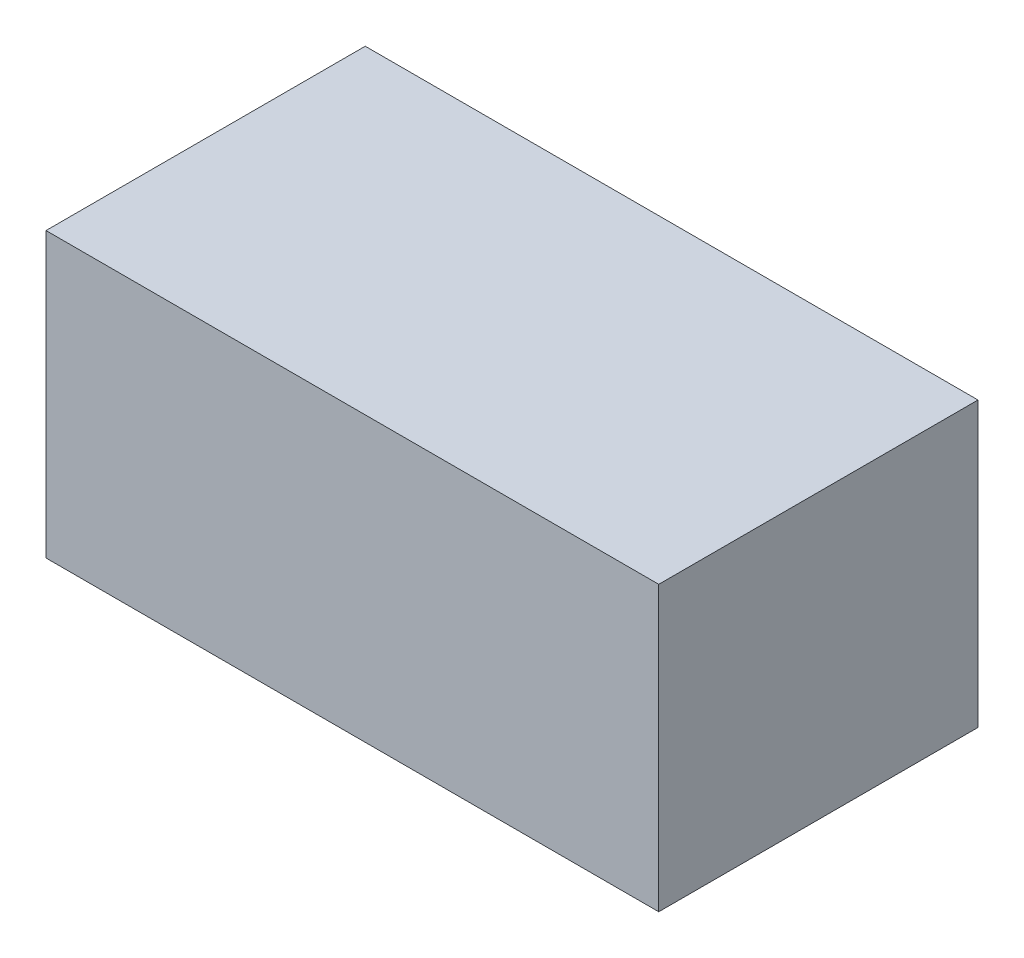
ISO-10303-21;
HEADER;
FILE_DESCRIPTION(('STEP AP214'),'2;1');
FILE_NAME('part.step','',(''),(''),'','','');
FILE_SCHEMA(('AUTOMOTIVE_DESIGN { 1 0 10303 214 1 1 1 1 }'));
ENDSEC;
DATA;
#1=APPLICATION_CONTEXT('core data for automotive mechanical design processes');
#2=APPLICATION_PROTOCOL_DEFINITION('international standard','automotive_design',2000,#1);
#3=PRODUCT_CONTEXT('',#1,'mechanical');
#4=PRODUCT('Part','Part','',(#3));
#5=PRODUCT_RELATED_PRODUCT_CATEGORY('part','',(#4));
#6=PRODUCT_DEFINITION_FORMATION('','',#4);
#7=PRODUCT_DEFINITION_CONTEXT('part definition',#1,'design');
#8=PRODUCT_DEFINITION('design','',#6,#7);
#9=PRODUCT_DEFINITION_SHAPE('','',#8);
#10=(LENGTH_UNIT() NAMED_UNIT(*) SI_UNIT(.MILLI.,.METRE.));
#11=(NAMED_UNIT(*) PLANE_ANGLE_UNIT() SI_UNIT($,.RADIAN.));
#12=(NAMED_UNIT(*) SI_UNIT($,.STERADIAN.) SOLID_ANGLE_UNIT());
#13=UNCERTAINTY_MEASURE_WITH_UNIT(LENGTH_MEASURE(1.E-05),#10,'distance_accuracy_value','');
#14=(GEOMETRIC_REPRESENTATION_CONTEXT(3) GLOBAL_UNCERTAINTY_ASSIGNED_CONTEXT((#13)) GLOBAL_UNIT_ASSIGNED_CONTEXT((#10,
#11,#12)) REPRESENTATION_CONTEXT('',''));
#15=CARTESIAN_POINT('',(0.,0.,0.));
#16=DIRECTION('',(0.,0.,1.));
#17=DIRECTION('',(1.,0.,0.));
#18=AXIS2_PLACEMENT_3D('',#15,#16,#17);
#19=CARTESIAN_POINT('',(0.,27.686,-15.5829));
#20=DIRECTION('',(1.,0.,0.));
#21=DIRECTION('',(0.,0.,-1.));
#22=AXIS2_PLACEMENT_3D('',#19,#20,#21);
#23=PLANE('',#22);
#24=DIRECTION('',(0.,0.,1.));
#25=VECTOR('',#24,1.);
#26=CARTESIAN_POINT('',(0.,0.,-15.5829));
#27=LINE('',#26,#25);
#28=CARTESIAN_POINT('',(0.,0.,-15.5829));
#29=VERTEX_POINT('',#28);
#30=CARTESIAN_POINT('',(0.,0.,15.5829));
#31=VERTEX_POINT('',#30);
#32=EDGE_CURVE('E98',#29,#31,#27,.T.);
#33=ORIENTED_EDGE('',*,*,#32,.T.);
#34=DIRECTION('',(0.,-1.,0.));
#35=VECTOR('',#34,1.);
#36=CARTESIAN_POINT('',(0.,27.686,15.5829));
#37=LINE('',#36,#35);
#38=CARTESIAN_POINT('',(0.,27.686,15.5829));
#39=VERTEX_POINT('',#38);
#40=EDGE_CURVE('E11',#39,#31,#37,.T.);
#41=ORIENTED_EDGE('',*,*,#40,.F.);
#42=DIRECTION('',(0.,0.,1.));
#43=VECTOR('',#42,1.);
#44=CARTESIAN_POINT('',(0.,27.686,-15.5829));
#45=LINE('',#44,#43);
#46=CARTESIAN_POINT('',(0.,27.686,-15.5829));
#47=VERTEX_POINT('',#46);
#48=EDGE_CURVE('E86',#47,#39,#45,.T.);
#49=ORIENTED_EDGE('',*,*,#48,.F.);
#50=DIRECTION('',(0.,-1.,0.));
#51=VECTOR('',#50,1.);
#52=CARTESIAN_POINT('',(0.,27.686,-15.5829));
#53=LINE('',#52,#51);
#54=EDGE_CURVE('E94',#47,#29,#53,.T.);
#55=ORIENTED_EDGE('',*,*,#54,.T.);
#56=EDGE_LOOP('',(#33,#41,#49,#55));
#57=FACE_BOUND('',#56,.T.);
#58=ADVANCED_FACE('F35',(#57),#23,.F.);
#59=CARTESIAN_POINT('',(0.,27.686,15.5829));
#60=DIRECTION('',(0.,0.,-1.));
#61=DIRECTION('',(-1.,0.,0.));
#62=AXIS2_PLACEMENT_3D('',#59,#60,#61);
#63=PLANE('',#62);
#64=DIRECTION('',(1.,0.,0.));
#65=VECTOR('',#64,1.);
#66=CARTESIAN_POINT('',(0.,0.,15.5829));
#67=LINE('',#66,#65);
#68=CARTESIAN_POINT('',(59.817,0.,15.5829));
#69=VERTEX_POINT('',#68);
#70=EDGE_CURVE('E90',#31,#69,#67,.T.);
#71=ORIENTED_EDGE('',*,*,#70,.T.);
#72=DIRECTION('',(0.,-1.,0.));
#73=VECTOR('',#72,1.);
#74=CARTESIAN_POINT('',(59.817,27.686,15.5829));
#75=LINE('',#74,#73);
#76=CARTESIAN_POINT('',(59.817,27.686,15.5829));
#77=VERTEX_POINT('',#76);
#78=EDGE_CURVE('E43',#77,#69,#75,.T.);
#79=ORIENTED_EDGE('',*,*,#78,.F.);
#80=DIRECTION('',(1.,0.,0.));
#81=VECTOR('',#80,1.);
#82=CARTESIAN_POINT('',(0.,27.686,15.5829));
#83=LINE('',#82,#81);
#84=EDGE_CURVE('E81',#39,#77,#83,.T.);
#85=ORIENTED_EDGE('',*,*,#84,.F.);
#86=ORIENTED_EDGE('',*,*,#40,.T.);
#87=EDGE_LOOP('',(#71,#79,#85,#86));
#88=FACE_BOUND('',#87,.T.);
#89=ADVANCED_FACE('F89',(#88),#63,.F.);
#90=CARTESIAN_POINT('',(59.817,27.686,-15.5829));
#91=DIRECTION('',(-1.,0.,0.));
#92=DIRECTION('',(0.,0.,1.));
#93=AXIS2_PLACEMENT_3D('',#90,#91,#92);
#94=PLANE('',#93);
#95=DIRECTION('',(0.,0.,-1.));
#96=VECTOR('',#95,1.);
#97=CARTESIAN_POINT('',(59.817,0.,-15.5829));
#98=LINE('',#97,#96);
#99=CARTESIAN_POINT('',(59.817,0.,-15.5829));
#100=VERTEX_POINT('',#99);
#101=EDGE_CURVE('E68',#69,#100,#98,.T.);
#102=ORIENTED_EDGE('',*,*,#101,.T.);
#103=DIRECTION('',(0.,-1.,0.));
#104=VECTOR('',#103,1.);
#105=CARTESIAN_POINT('',(59.817,27.686,-15.5829));
#106=LINE('',#105,#104);
#107=CARTESIAN_POINT('',(59.817,27.686,-15.5829));
#108=VERTEX_POINT('',#107);
#109=EDGE_CURVE('E91',#108,#100,#106,.T.);
#110=ORIENTED_EDGE('',*,*,#109,.F.);
#111=DIRECTION('',(0.,0.,-1.));
#112=VECTOR('',#111,1.);
#113=CARTESIAN_POINT('',(59.817,27.686,-15.5829));
#114=LINE('',#113,#112);
#115=EDGE_CURVE('E84',#77,#108,#114,.T.);
#116=ORIENTED_EDGE('',*,*,#115,.F.);
#117=ORIENTED_EDGE('',*,*,#78,.T.);
#118=EDGE_LOOP('',(#102,#110,#116,#117));
#119=FACE_BOUND('',#118,.T.);
#120=ADVANCED_FACE('F92',(#119),#94,.F.);
#121=CARTESIAN_POINT('',(0.,27.686,-15.5829));
#122=DIRECTION('',(0.,0.,1.));
#123=DIRECTION('',(1.,0.,0.));
#124=AXIS2_PLACEMENT_3D('',#121,#122,#123);
#125=PLANE('',#124);
#126=DIRECTION('',(-1.,0.,0.));
#127=VECTOR('',#126,1.);
#128=CARTESIAN_POINT('',(0.,0.,-15.5829));
#129=LINE('',#128,#127);
#130=EDGE_CURVE('E74',#100,#29,#129,.T.);
#131=ORIENTED_EDGE('',*,*,#130,.T.);
#132=ORIENTED_EDGE('',*,*,#54,.F.);
#133=DIRECTION('',(-1.,0.,0.));
#134=VECTOR('',#133,1.);
#135=CARTESIAN_POINT('',(0.,27.686,-15.5829));
#136=LINE('',#135,#134);
#137=EDGE_CURVE('E51',#108,#47,#136,.T.);
#138=ORIENTED_EDGE('',*,*,#137,.F.);
#139=ORIENTED_EDGE('',*,*,#109,.T.);
#140=EDGE_LOOP('',(#131,#132,#138,#139));
#141=FACE_BOUND('',#140,.T.);
#142=ADVANCED_FACE('F105',(#141),#125,.F.);
#143=CARTESIAN_POINT('',(0.,27.686,0.));
#144=DIRECTION('',(0.,1.,0.));
#145=DIRECTION('',(0.,0.,1.));
#146=AXIS2_PLACEMENT_3D('',#143,#144,#145);
#147=PLANE('',#146);
#148=ORIENTED_EDGE('',*,*,#48,.T.);
#149=ORIENTED_EDGE('',*,*,#84,.T.);
#150=ORIENTED_EDGE('',*,*,#115,.T.);
#151=ORIENTED_EDGE('',*,*,#137,.T.);
#152=EDGE_LOOP('',(#148,#149,#150,#151));
#153=FACE_BOUND('',#152,.T.);
#154=ADVANCED_FACE('F82',(#153),#147,.T.);
#155=CARTESIAN_POINT('',(0.,0.,0.));
#156=DIRECTION('',(0.,1.,0.));
#157=DIRECTION('',(0.,0.,1.));
#158=AXIS2_PLACEMENT_3D('',#155,#156,#157);
#159=PLANE('',#158);
#160=ORIENTED_EDGE('',*,*,#32,.F.);
#161=ORIENTED_EDGE('',*,*,#130,.F.);
#162=ORIENTED_EDGE('',*,*,#101,.F.);
#163=ORIENTED_EDGE('',*,*,#70,.F.);
#164=EDGE_LOOP('',(#160,#161,#162,#163));
#165=FACE_BOUND('',#164,.T.);
#166=ADVANCED_FACE('F108',(#165),#159,.F.);
#167=CLOSED_SHELL('',(#58,#89,#120,#142,#154,#166));
#168=MANIFOLD_SOLID_BREP('B2',#167);
#169=ADVANCED_BREP_SHAPE_REPRESENTATION('',(#18,#168),#14);
#170=SHAPE_DEFINITION_REPRESENTATION(#9,#169);
ENDSEC;
END-ISO-10303-21;
